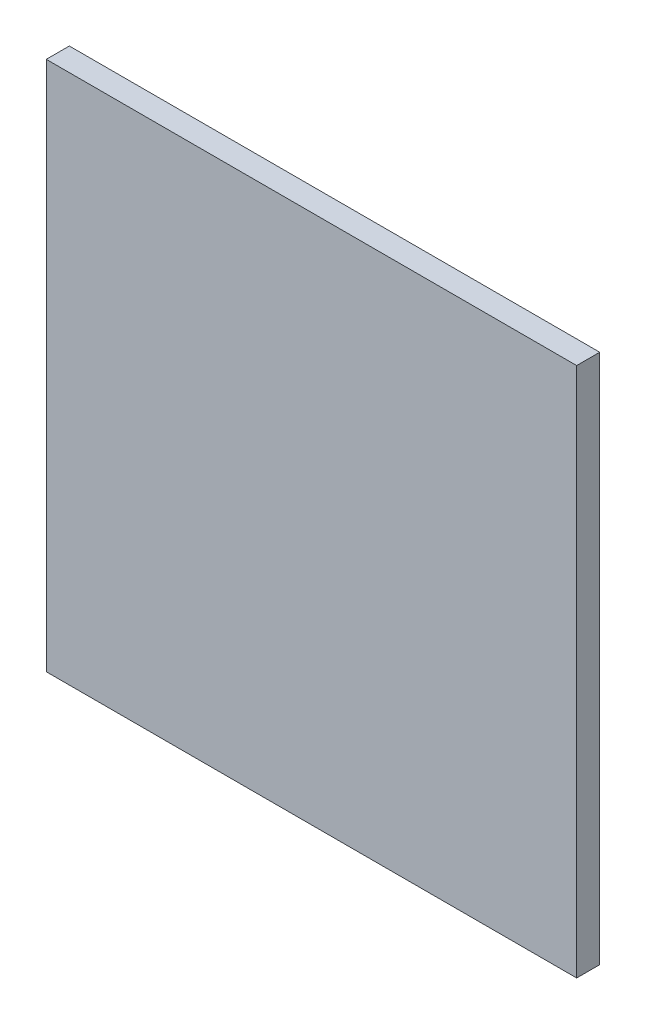
ISO-10303-21;
HEADER;
FILE_DESCRIPTION(('STEP AP214'),'2;1');
FILE_NAME('part.step','',(''),(''),'','','');
FILE_SCHEMA(('AUTOMOTIVE_DESIGN { 1 0 10303 214 1 1 1 1 }'));
ENDSEC;
DATA;
#1=APPLICATION_CONTEXT('core data for automotive mechanical design processes');
#2=APPLICATION_PROTOCOL_DEFINITION('international standard','automotive_design',2000,#1);
#3=PRODUCT_CONTEXT('',#1,'mechanical');
#4=PRODUCT('Part','Part','',(#3));
#5=PRODUCT_RELATED_PRODUCT_CATEGORY('part','',(#4));
#6=PRODUCT_DEFINITION_FORMATION('','',#4);
#7=PRODUCT_DEFINITION_CONTEXT('part definition',#1,'design');
#8=PRODUCT_DEFINITION('design','',#6,#7);
#9=PRODUCT_DEFINITION_SHAPE('','',#8);
#10=(LENGTH_UNIT() NAMED_UNIT(*) SI_UNIT(.MILLI.,.METRE.));
#11=(NAMED_UNIT(*) PLANE_ANGLE_UNIT() SI_UNIT($,.RADIAN.));
#12=(NAMED_UNIT(*) SI_UNIT($,.STERADIAN.) SOLID_ANGLE_UNIT());
#13=UNCERTAINTY_MEASURE_WITH_UNIT(LENGTH_MEASURE(1.E-05),#10,'distance_accuracy_value','');
#14=(GEOMETRIC_REPRESENTATION_CONTEXT(3) GLOBAL_UNCERTAINTY_ASSIGNED_CONTEXT((#13)) GLOBAL_UNIT_ASSIGNED_CONTEXT((#10,
#11,#12)) REPRESENTATION_CONTEXT('',''));
#15=CARTESIAN_POINT('',(0.,0.,0.));
#16=DIRECTION('',(0.,0.,1.));
#17=DIRECTION('',(1.,0.,0.));
#18=AXIS2_PLACEMENT_3D('',#15,#16,#17);
#19=CARTESIAN_POINT('',(0.,0.,20.));
#20=DIRECTION('',(1.,0.,0.));
#21=DIRECTION('',(0.,1.,0.));
#22=AXIS2_PLACEMENT_3D('',#19,#20,#21);
#23=PLANE('',#22);
#24=DIRECTION('',(0.,-1.,0.));
#25=VECTOR('',#24,1.);
#26=CARTESIAN_POINT('',(0.,0.,0.));
#27=LINE('',#26,#25);
#28=CARTESIAN_POINT('',(0.,0.,0.));
#29=VERTEX_POINT('',#28);
#30=CARTESIAN_POINT('',(0.,-460.,0.));
#31=VERTEX_POINT('',#30);
#32=EDGE_CURVE('E95',#29,#31,#27,.T.);
#33=ORIENTED_EDGE('',*,*,#32,.T.);
#34=DIRECTION('',(0.,0.,-1.));
#35=VECTOR('',#34,1.);
#36=CARTESIAN_POINT('',(0.,-460.,20.));
#37=LINE('',#36,#35);
#38=CARTESIAN_POINT('',(0.,-460.,20.));
#39=VERTEX_POINT('',#38);
#40=EDGE_CURVE('E11',#39,#31,#37,.T.);
#41=ORIENTED_EDGE('',*,*,#40,.F.);
#42=DIRECTION('',(0.,-1.,0.));
#43=VECTOR('',#42,1.);
#44=CARTESIAN_POINT('',(0.,0.,20.));
#45=LINE('',#44,#43);
#46=CARTESIAN_POINT('',(0.,0.,20.));
#47=VERTEX_POINT('',#46);
#48=EDGE_CURVE('E83',#47,#39,#45,.T.);
#49=ORIENTED_EDGE('',*,*,#48,.F.);
#50=DIRECTION('',(0.,0.,-1.));
#51=VECTOR('',#50,1.);
#52=CARTESIAN_POINT('',(0.,0.,20.));
#53=LINE('',#52,#51);
#54=EDGE_CURVE('E91',#47,#29,#53,.T.);
#55=ORIENTED_EDGE('',*,*,#54,.T.);
#56=EDGE_LOOP('',(#33,#41,#49,#55));
#57=FACE_BOUND('',#56,.T.);
#58=ADVANCED_FACE('F32',(#57),#23,.F.);
#59=CARTESIAN_POINT('',(0.,-460.,20.));
#60=DIRECTION('',(0.,1.,0.));
#61=DIRECTION('',(0.,0.,1.));
#62=AXIS2_PLACEMENT_3D('',#59,#60,#61);
#63=PLANE('',#62);
#64=DIRECTION('',(1.,0.,0.));
#65=VECTOR('',#64,1.);
#66=CARTESIAN_POINT('',(0.,-460.,0.));
#67=LINE('',#66,#65);
#68=CARTESIAN_POINT('',(460.,-460.,0.));
#69=VERTEX_POINT('',#68);
#70=EDGE_CURVE('E87',#31,#69,#67,.T.);
#71=ORIENTED_EDGE('',*,*,#70,.T.);
#72=DIRECTION('',(0.,0.,-1.));
#73=VECTOR('',#72,1.);
#74=CARTESIAN_POINT('',(460.,-460.,20.));
#75=LINE('',#74,#73);
#76=CARTESIAN_POINT('',(460.,-460.,20.));
#77=VERTEX_POINT('',#76);
#78=EDGE_CURVE('E40',#77,#69,#75,.T.);
#79=ORIENTED_EDGE('',*,*,#78,.F.);
#80=DIRECTION('',(1.,0.,0.));
#81=VECTOR('',#80,1.);
#82=CARTESIAN_POINT('',(0.,-460.,20.));
#83=LINE('',#82,#81);
#84=EDGE_CURVE('E78',#39,#77,#83,.T.);
#85=ORIENTED_EDGE('',*,*,#84,.F.);
#86=ORIENTED_EDGE('',*,*,#40,.T.);
#87=EDGE_LOOP('',(#71,#79,#85,#86));
#88=FACE_BOUND('',#87,.T.);
#89=ADVANCED_FACE('F86',(#88),#63,.F.);
#90=CARTESIAN_POINT('',(460.,0.,20.));
#91=DIRECTION('',(-1.,0.,0.));
#92=DIRECTION('',(0.,0.,1.));
#93=AXIS2_PLACEMENT_3D('',#90,#91,#92);
#94=PLANE('',#93);
#95=DIRECTION('',(0.,1.,0.));
#96=VECTOR('',#95,1.);
#97=CARTESIAN_POINT('',(460.,0.,0.));
#98=LINE('',#97,#96);
#99=CARTESIAN_POINT('',(460.,0.,0.));
#100=VERTEX_POINT('',#99);
#101=EDGE_CURVE('E65',#69,#100,#98,.T.);
#102=ORIENTED_EDGE('',*,*,#101,.T.);
#103=DIRECTION('',(0.,0.,-1.));
#104=VECTOR('',#103,1.);
#105=CARTESIAN_POINT('',(460.,0.,20.));
#106=LINE('',#105,#104);
#107=CARTESIAN_POINT('',(460.,0.,20.));
#108=VERTEX_POINT('',#107);
#109=EDGE_CURVE('E88',#108,#100,#106,.T.);
#110=ORIENTED_EDGE('',*,*,#109,.F.);
#111=DIRECTION('',(0.,1.,0.));
#112=VECTOR('',#111,1.);
#113=CARTESIAN_POINT('',(460.,0.,20.));
#114=LINE('',#113,#112);
#115=EDGE_CURVE('E81',#77,#108,#114,.T.);
#116=ORIENTED_EDGE('',*,*,#115,.F.);
#117=ORIENTED_EDGE('',*,*,#78,.T.);
#118=EDGE_LOOP('',(#102,#110,#116,#117));
#119=FACE_BOUND('',#118,.T.);
#120=ADVANCED_FACE('F89',(#119),#94,.F.);
#121=CARTESIAN_POINT('',(0.,0.,20.));
#122=DIRECTION('',(0.,-1.,0.));
#123=DIRECTION('',(0.,0.,-1.));
#124=AXIS2_PLACEMENT_3D('',#121,#122,#123);
#125=PLANE('',#124);
#126=DIRECTION('',(-1.,0.,0.));
#127=VECTOR('',#126,1.);
#128=CARTESIAN_POINT('',(0.,0.,0.));
#129=LINE('',#128,#127);
#130=EDGE_CURVE('E71',#100,#29,#129,.T.);
#131=ORIENTED_EDGE('',*,*,#130,.T.);
#132=ORIENTED_EDGE('',*,*,#54,.F.);
#133=DIRECTION('',(-1.,0.,0.));
#134=VECTOR('',#133,1.);
#135=CARTESIAN_POINT('',(0.,0.,20.));
#136=LINE('',#135,#134);
#137=EDGE_CURVE('E48',#108,#47,#136,.T.);
#138=ORIENTED_EDGE('',*,*,#137,.F.);
#139=ORIENTED_EDGE('',*,*,#109,.T.);
#140=EDGE_LOOP('',(#131,#132,#138,#139));
#141=FACE_BOUND('',#140,.T.);
#142=ADVANCED_FACE('F102',(#141),#125,.F.);
#143=CARTESIAN_POINT('',(0.,0.,20.));
#144=DIRECTION('',(0.,0.,1.));
#145=DIRECTION('',(1.,0.,0.));
#146=AXIS2_PLACEMENT_3D('',#143,#144,#145);
#147=PLANE('',#146);
#148=ORIENTED_EDGE('',*,*,#48,.T.);
#149=ORIENTED_EDGE('',*,*,#84,.T.);
#150=ORIENTED_EDGE('',*,*,#115,.T.);
#151=ORIENTED_EDGE('',*,*,#137,.T.);
#152=EDGE_LOOP('',(#148,#149,#150,#151));
#153=FACE_BOUND('',#152,.T.);
#154=ADVANCED_FACE('F79',(#153),#147,.T.);
#155=CARTESIAN_POINT('',(0.,0.,0.));
#156=DIRECTION('',(0.,0.,1.));
#157=DIRECTION('',(1.,0.,0.));
#158=AXIS2_PLACEMENT_3D('',#155,#156,#157);
#159=PLANE('',#158);
#160=ORIENTED_EDGE('',*,*,#32,.F.);
#161=ORIENTED_EDGE('',*,*,#130,.F.);
#162=ORIENTED_EDGE('',*,*,#101,.F.);
#163=ORIENTED_EDGE('',*,*,#70,.F.);
#164=EDGE_LOOP('',(#160,#161,#162,#163));
#165=FACE_BOUND('',#164,.T.);
#166=ADVANCED_FACE('F105',(#165),#159,.F.);
#167=CLOSED_SHELL('',(#58,#89,#120,#142,#154,#166));
#168=MANIFOLD_SOLID_BREP('B2',#167);
#169=ADVANCED_BREP_SHAPE_REPRESENTATION('',(#18,#168),#14);
#170=SHAPE_DEFINITION_REPRESENTATION(#9,#169);
ENDSEC;
END-ISO-10303-21;
